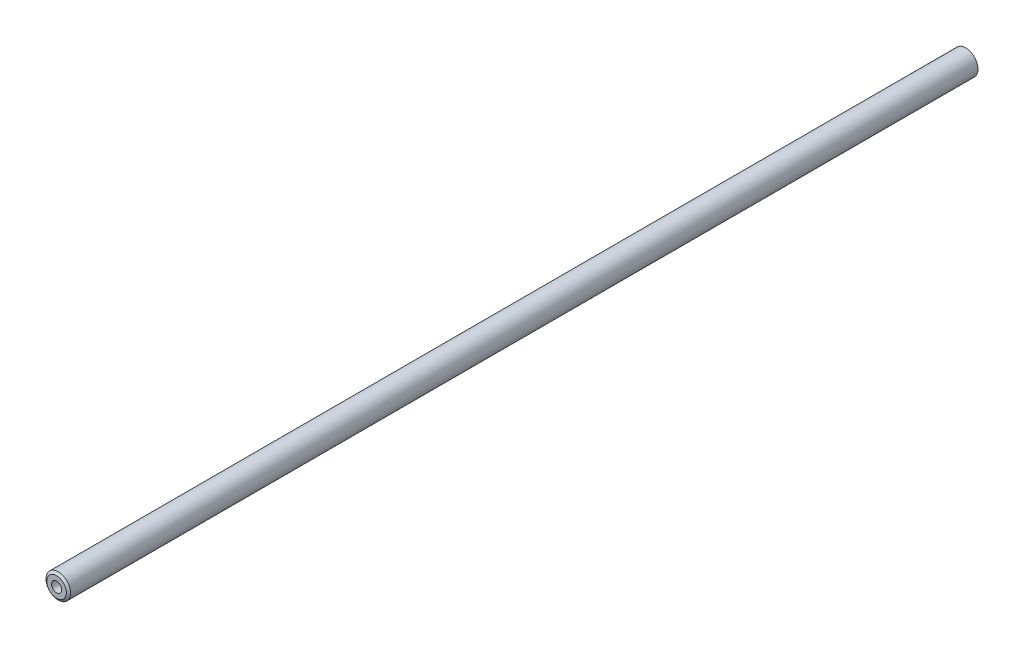
ISO-10303-21;
HEADER;
FILE_DESCRIPTION(('STEP AP214'),'2;1');
FILE_NAME('part.step','',(''),(''),'','','');
FILE_SCHEMA(('AUTOMOTIVE_DESIGN { 1 0 10303 214 1 1 1 1 }'));
ENDSEC;
DATA;
#1=APPLICATION_CONTEXT('core data for automotive mechanical design processes');
#2=APPLICATION_PROTOCOL_DEFINITION('international standard','automotive_design',2000,#1);
#3=PRODUCT_CONTEXT('',#1,'mechanical');
#4=PRODUCT('Part','Part','',(#3));
#5=PRODUCT_RELATED_PRODUCT_CATEGORY('part','',(#4));
#6=PRODUCT_DEFINITION_FORMATION('','',#4);
#7=PRODUCT_DEFINITION_CONTEXT('part definition',#1,'design');
#8=PRODUCT_DEFINITION('design','',#6,#7);
#9=PRODUCT_DEFINITION_SHAPE('','',#8);
#10=(LENGTH_UNIT() NAMED_UNIT(*) SI_UNIT(.MILLI.,.METRE.));
#11=(NAMED_UNIT(*) PLANE_ANGLE_UNIT() SI_UNIT($,.RADIAN.));
#12=(NAMED_UNIT(*) SI_UNIT($,.STERADIAN.) SOLID_ANGLE_UNIT());
#13=UNCERTAINTY_MEASURE_WITH_UNIT(LENGTH_MEASURE(1.E-05),#10,'distance_accuracy_value','');
#14=(GEOMETRIC_REPRESENTATION_CONTEXT(3) GLOBAL_UNCERTAINTY_ASSIGNED_CONTEXT((#13)) GLOBAL_UNIT_ASSIGNED_CONTEXT((#10,
#11,#12)) REPRESENTATION_CONTEXT('',''));
#15=CARTESIAN_POINT('',(0.,0.,0.));
#16=DIRECTION('',(0.,0.,1.));
#17=DIRECTION('',(1.,0.,0.));
#18=AXIS2_PLACEMENT_3D('',#15,#16,#17);
#19=CARTESIAN_POINT('',(0.,3.19999999999995,-148.5));
#20=DIRECTION('',(0.,0.,1.));
#21=DIRECTION('',(0.,-1.,0.));
#22=AXIS2_PLACEMENT_3D('',#19,#20,#21);
#23=PLANE('',#22);
#24=CARTESIAN_POINT('',(0.,0.,-148.5));
#25=DIRECTION('',(0.,0.,1.));
#26=DIRECTION('',(0.,-1.,0.));
#27=AXIS2_PLACEMENT_3D('',#24,#25,#26);
#28=CIRCLE('',#27,3.19999999999998);
#29=CARTESIAN_POINT('',(0.,-3.20000000000002,-148.5));
#30=VERTEX_POINT('',#29);
#31=EDGE_CURVE('E63',#30,#30,#28,.T.);
#32=ORIENTED_EDGE('',*,*,#31,.F.);
#33=EDGE_LOOP('',(#32));
#34=FACE_BOUND('',#33,.T.);
#35=CARTESIAN_POINT('',(0.,0.,-148.5));
#36=DIRECTION('',(0.,0.,1.));
#37=DIRECTION('',(1.,0.,0.));
#38=AXIS2_PLACEMENT_3D('',#35,#36,#37);
#39=CIRCLE('',#38,1.65000000000002);
#40=CARTESIAN_POINT('',(1.65000000000002,0.,-148.5));
#41=VERTEX_POINT('',#40);
#42=EDGE_CURVE('E69',#41,#41,#39,.T.);
#43=ORIENTED_EDGE('',*,*,#42,.T.);
#44=EDGE_LOOP('',(#43));
#45=FACE_BOUND('',#44,.T.);
#46=ADVANCED_FACE('F48',(#34,#45),#23,.F.);
#47=CARTESIAN_POINT('',(0.,0.,148.5));
#48=DIRECTION('',(0.,0.,-1.));
#49=DIRECTION('',(0.,1.,0.));
#50=AXIS2_PLACEMENT_3D('',#47,#48,#49);
#51=PLANE('',#50);
#52=CARTESIAN_POINT('',(0.,0.,148.5));
#53=DIRECTION('',(0.,0.,1.));
#54=DIRECTION('',(1.,0.,0.));
#55=AXIS2_PLACEMENT_3D('',#52,#53,#54);
#56=CIRCLE('',#55,1.64999999999998);
#57=CARTESIAN_POINT('',(1.64999999999998,0.,148.5));
#58=VERTEX_POINT('',#57);
#59=EDGE_CURVE('E75',#58,#58,#56,.T.);
#60=ORIENTED_EDGE('',*,*,#59,.F.);
#61=EDGE_LOOP('',(#60));
#62=FACE_BOUND('',#61,.T.);
#63=CARTESIAN_POINT('',(0.,-7.64494782554317E-13,148.5));
#64=DIRECTION('',(0.,0.,1.));
#65=DIRECTION('',(0.,-1.,0.));
#66=AXIS2_PLACEMENT_3D('',#63,#64,#65);
#67=CIRCLE('',#66,3.20000000000071);
#68=CARTESIAN_POINT('',(0.,-3.20000000000147,148.5));
#69=VERTEX_POINT('',#68);
#70=EDGE_CURVE('E12',#69,#69,#67,.T.);
#71=ORIENTED_EDGE('',*,*,#70,.T.);
#72=EDGE_LOOP('',(#71));
#73=FACE_BOUND('',#72,.T.);
#74=ADVANCED_FACE('F50',(#62,#73),#51,.F.);
#75=CARTESIAN_POINT('',(0.,-7.6312113762457E-13,147.939833969432));
#76=DIRECTION('',(0.,0.,-1.));
#77=DIRECTION('',(0.,1.,0.));
#78=AXIS2_PLACEMENT_3D('',#75,#76,#77);
#79=CONICAL_SURFACE('',#78,4.00000000000076,0.959931088596839);
#80=ORIENTED_EDGE('',*,*,#70,.F.);
#81=EDGE_LOOP('',(#80));
#82=FACE_BOUND('',#81,.T.);
#83=CARTESIAN_POINT('',(0.,-7.6312113762457E-13,147.939833969432));
#84=DIRECTION('',(0.,0.,1.));
#85=DIRECTION('',(0.,-1.,0.));
#86=AXIS2_PLACEMENT_3D('',#83,#84,#85);
#87=CIRCLE('',#86,4.00000000000076);
#88=CARTESIAN_POINT('',(0.,-4.00000000000153,147.939833969432));
#89=VERTEX_POINT('',#88);
#90=EDGE_CURVE('E55',#89,#89,#87,.T.);
#91=ORIENTED_EDGE('',*,*,#90,.T.);
#92=EDGE_LOOP('',(#91));
#93=FACE_BOUND('',#92,.T.);
#94=ADVANCED_FACE('F91',(#82,#93),#79,.T.);
#95=CARTESIAN_POINT('',(0.,0.,-148.5));
#96=DIRECTION('',(0.,0.,1.));
#97=DIRECTION('',(0.,-1.,0.));
#98=AXIS2_PLACEMENT_3D('',#95,#96,#97);
#99=CYLINDRICAL_SURFACE('',#98,4.0000000000004);
#100=ORIENTED_EDGE('',*,*,#90,.F.);
#101=EDGE_LOOP('',(#100));
#102=FACE_BOUND('',#101,.T.);
#103=CARTESIAN_POINT('',(0.,0.,-147.939833969432));
#104=DIRECTION('',(0.,0.,1.));
#105=DIRECTION('',(0.,-1.,0.));
#106=AXIS2_PLACEMENT_3D('',#103,#104,#105);
#107=CIRCLE('',#106,4.00000000000004);
#108=CARTESIAN_POINT('',(0.,-4.00000000000008,-147.939833969432));
#109=VERTEX_POINT('',#108);
#110=EDGE_CURVE('E59',#109,#109,#107,.T.);
#111=ORIENTED_EDGE('',*,*,#110,.T.);
#112=EDGE_LOOP('',(#111));
#113=FACE_BOUND('',#112,.T.);
#114=ADVANCED_FACE('F96',(#102,#113),#99,.T.);
#115=CARTESIAN_POINT('',(0.,0.,-148.5));
#116=DIRECTION('',(0.,0.,1.));
#117=DIRECTION('',(0.,-1.,0.));
#118=AXIS2_PLACEMENT_3D('',#115,#116,#117);
#119=CONICAL_SURFACE('',#118,3.19999999999998,0.959931088596887);
#120=ORIENTED_EDGE('',*,*,#110,.F.);
#121=EDGE_LOOP('',(#120));
#122=FACE_BOUND('',#121,.T.);
#123=ORIENTED_EDGE('',*,*,#31,.T.);
#124=EDGE_LOOP('',(#123));
#125=FACE_BOUND('',#124,.T.);
#126=ADVANCED_FACE('F108',(#122,#125),#119,.T.);
#127=CARTESIAN_POINT('',(0.,0.,-138.5));
#128=DIRECTION('',(0.,0.,-1.));
#129=DIRECTION('',(-1.,0.,0.));
#130=AXIS2_PLACEMENT_3D('',#127,#128,#129);
#131=CYLINDRICAL_SURFACE('',#130,1.65000000000002);
#132=CARTESIAN_POINT('',(0.,0.,-138.5));
#133=DIRECTION('',(0.,0.,1.));
#134=DIRECTION('',(1.,0.,0.));
#135=AXIS2_PLACEMENT_3D('',#132,#133,#134);
#136=CIRCLE('',#135,1.65000000000002);
#137=CARTESIAN_POINT('',(1.65000000000002,0.,-138.5));
#138=VERTEX_POINT('',#137);
#139=EDGE_CURVE('E68',#138,#138,#136,.T.);
#140=ORIENTED_EDGE('',*,*,#139,.T.);
#141=EDGE_LOOP('',(#140));
#142=FACE_BOUND('',#141,.T.);
#143=ORIENTED_EDGE('',*,*,#42,.F.);
#144=EDGE_LOOP('',(#143));
#145=FACE_BOUND('',#144,.T.);
#146=ADVANCED_FACE('F106',(#142,#145),#131,.F.);
#147=CARTESIAN_POINT('',(0.,0.,-138.5));
#148=DIRECTION('',(0.,0.,1.));
#149=DIRECTION('',(1.,0.,0.));
#150=AXIS2_PLACEMENT_3D('',#147,#148,#149);
#151=PLANE('',#150);
#152=ORIENTED_EDGE('',*,*,#139,.F.);
#153=EDGE_LOOP('',(#152));
#154=FACE_BOUND('',#153,.T.);
#155=ADVANCED_FACE('F86',(#154),#151,.F.);
#156=CARTESIAN_POINT('',(0.,0.,136.5));
#157=DIRECTION('',(0.,0.,1.));
#158=DIRECTION('',(1.,0.,0.));
#159=AXIS2_PLACEMENT_3D('',#156,#157,#158);
#160=CYLINDRICAL_SURFACE('',#159,1.64999999999998);
#161=CARTESIAN_POINT('',(0.,0.,136.5));
#162=DIRECTION('',(0.,0.,1.));
#163=DIRECTION('',(1.,0.,0.));
#164=AXIS2_PLACEMENT_3D('',#161,#162,#163);
#165=CIRCLE('',#164,1.64999999999998);
#166=CARTESIAN_POINT('',(1.64999999999998,0.,136.5));
#167=VERTEX_POINT('',#166);
#168=EDGE_CURVE('E72',#167,#167,#165,.T.);
#169=ORIENTED_EDGE('',*,*,#168,.F.);
#170=EDGE_LOOP('',(#169));
#171=FACE_BOUND('',#170,.T.);
#172=ORIENTED_EDGE('',*,*,#59,.T.);
#173=EDGE_LOOP('',(#172));
#174=FACE_BOUND('',#173,.T.);
#175=ADVANCED_FACE('F83',(#171,#174),#160,.F.);
#176=CARTESIAN_POINT('',(0.,0.,136.5));
#177=DIRECTION('',(0.,0.,1.));
#178=DIRECTION('',(1.,0.,0.));
#179=AXIS2_PLACEMENT_3D('',#176,#177,#178);
#180=PLANE('',#179);
#181=ORIENTED_EDGE('',*,*,#168,.T.);
#182=EDGE_LOOP('',(#181));
#183=FACE_BOUND('',#182,.T.);
#184=ADVANCED_FACE('F81',(#183),#180,.T.);
#185=CLOSED_SHELL('',(#46,#74,#94,#114,#126,#146,#155,#175,#184));
#186=MANIFOLD_SOLID_BREP('B2',#185);
#187=ADVANCED_BREP_SHAPE_REPRESENTATION('',(#18,#186),#14);
#188=SHAPE_DEFINITION_REPRESENTATION(#9,#187);
ENDSEC;
END-ISO-10303-21;
